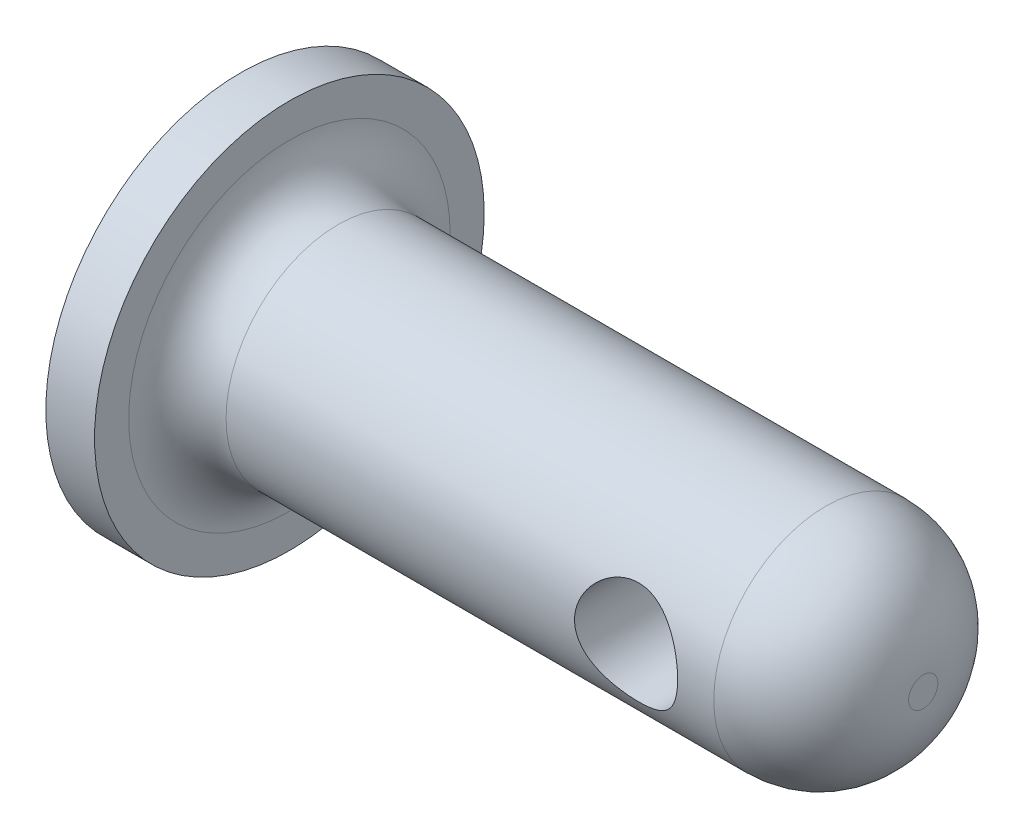
ISO-10303-21;
HEADER;
FILE_DESCRIPTION(('STEP AP214'),'2;1');
FILE_NAME('part.step','',(''),(''),'','','');
FILE_SCHEMA(('AUTOMOTIVE_DESIGN { 1 0 10303 214 1 1 1 1 }'));
ENDSEC;
DATA;
#1=APPLICATION_CONTEXT('core data for automotive mechanical design processes');
#2=APPLICATION_PROTOCOL_DEFINITION('international standard','automotive_design',2000,#1);
#3=PRODUCT_CONTEXT('',#1,'mechanical');
#4=PRODUCT('Part','Part','',(#3));
#5=PRODUCT_RELATED_PRODUCT_CATEGORY('part','',(#4));
#6=PRODUCT_DEFINITION_FORMATION('','',#4);
#7=PRODUCT_DEFINITION_CONTEXT('part definition',#1,'design');
#8=PRODUCT_DEFINITION('design','',#6,#7);
#9=PRODUCT_DEFINITION_SHAPE('','',#8);
#10=(LENGTH_UNIT() NAMED_UNIT(*) SI_UNIT(.MILLI.,.METRE.));
#11=(NAMED_UNIT(*) PLANE_ANGLE_UNIT() SI_UNIT($,.RADIAN.));
#12=(NAMED_UNIT(*) SI_UNIT($,.STERADIAN.) SOLID_ANGLE_UNIT());
#13=UNCERTAINTY_MEASURE_WITH_UNIT(LENGTH_MEASURE(1.E-05),#10,'distance_accuracy_value','');
#14=(GEOMETRIC_REPRESENTATION_CONTEXT(3) GLOBAL_UNCERTAINTY_ASSIGNED_CONTEXT((#13)) GLOBAL_UNIT_ASSIGNED_CONTEXT((#10,
#11,#12)) REPRESENTATION_CONTEXT('',''));
#15=CARTESIAN_POINT('',(0.,0.,0.));
#16=DIRECTION('',(0.,0.,1.));
#17=DIRECTION('',(1.,0.,0.));
#18=AXIS2_PLACEMENT_3D('',#15,#16,#17);
#19=CARTESIAN_POINT('',(5.,0.,0.));
#20=DIRECTION('',(-1.,0.,0.));
#21=DIRECTION('',(0.,0.,1.));
#22=AXIS2_PLACEMENT_3D('',#19,#20,#21);
#23=CYLINDRICAL_SURFACE('',#22,20.);
#24=CARTESIAN_POINT('',(5.,0.,0.));
#25=DIRECTION('',(1.,0.,0.));
#26=DIRECTION('',(0.,0.,-1.));
#27=AXIS2_PLACEMENT_3D('',#24,#25,#26);
#28=CIRCLE('',#27,20.);
#29=CARTESIAN_POINT('',(5.,0.,-20.));
#30=VERTEX_POINT('',#29);
#31=EDGE_CURVE('E109',#30,#30,#28,.T.);
#32=ORIENTED_EDGE('',*,*,#31,.F.);
#33=EDGE_LOOP('',(#32));
#34=FACE_BOUND('',#33,.T.);
#35=CARTESIAN_POINT('',(0.,0.,0.));
#36=DIRECTION('',(1.,0.,0.));
#37=DIRECTION('',(0.,0.,-1.));
#38=AXIS2_PLACEMENT_3D('',#35,#36,#37);
#39=CIRCLE('',#38,20.);
#40=CARTESIAN_POINT('',(0.,0.,-20.));
#41=VERTEX_POINT('',#40);
#42=EDGE_CURVE('E107',#41,#41,#39,.T.);
#43=ORIENTED_EDGE('',*,*,#42,.T.);
#44=EDGE_LOOP('',(#43));
#45=FACE_BOUND('',#44,.T.);
#46=ADVANCED_FACE('F41',(#34,#45),#23,.T.);
#47=CARTESIAN_POINT('',(5.,0.,0.));
#48=DIRECTION('',(1.,0.,0.));
#49=DIRECTION('',(0.,0.,-1.));
#50=AXIS2_PLACEMENT_3D('',#47,#48,#49);
#51=PLANE('',#50);
#52=CARTESIAN_POINT('',(5.,0.,0.));
#53=DIRECTION('',(1.,0.,0.));
#54=DIRECTION('',(0.,0.,-1.));
#55=AXIS2_PLACEMENT_3D('',#52,#53,#54);
#56=CIRCLE('',#55,16.5);
#57=CARTESIAN_POINT('',(5.,0.,-16.5));
#58=VERTEX_POINT('',#57);
#59=EDGE_CURVE('E10',#58,#58,#56,.F.);
#60=ORIENTED_EDGE('',*,*,#59,.T.);
#61=EDGE_LOOP('',(#60));
#62=FACE_BOUND('',#61,.T.);
#63=ORIENTED_EDGE('',*,*,#31,.T.);
#64=EDGE_LOOP('',(#63));
#65=FACE_BOUND('',#64,.T.);
#66=ADVANCED_FACE('F92',(#62,#65),#51,.T.);
#67=CARTESIAN_POINT('',(0.,0.,0.));
#68=DIRECTION('',(1.,0.,0.));
#69=DIRECTION('',(0.,0.,-1.));
#70=AXIS2_PLACEMENT_3D('',#67,#68,#69);
#71=PLANE('',#70);
#72=ORIENTED_EDGE('',*,*,#42,.F.);
#73=EDGE_LOOP('',(#72));
#74=FACE_BOUND('',#73,.T.);
#75=ADVANCED_FACE('F88',(#74),#71,.F.);
#76=CARTESIAN_POINT('',(70.0621980882499,0.,0.));
#77=DIRECTION('',(-1.,0.,0.));
#78=DIRECTION('',(0.,0.,1.));
#79=AXIS2_PLACEMENT_3D('',#76,#77,#78);
#80=CYLINDRICAL_SURFACE('',#79,11.5);
#81=CARTESIAN_POINT('',(56.3551148710914,0.,11.5));
#82=CARTESIAN_POINT('',(56.3551138637718,-0.140487088247556,11.4999991408906));
#83=CARTESIAN_POINT('',(56.3495144400302,-0.281002971891712,11.4974190525056));
#84=CARTESIAN_POINT('',(56.3271741490649,-0.561016703007874,11.4871627988924));
#85=CARTESIAN_POINT('',(56.3104273285909,-0.700513966221892,11.4794839106632));
#86=CARTESIAN_POINT('',(56.2659393151098,-0.977635517913756,11.4592129661582));
#87=CARTESIAN_POINT('',(56.2381788321788,-1.11525607964285,11.4466122901998));
#88=CARTESIAN_POINT('',(56.1719541522931,-1.38744058689531,11.4168194164316));
#89=CARTESIAN_POINT('',(56.133485579242,-1.52200325837463,11.3996253415443));
#90=CARTESIAN_POINT('',(56.0464125010414,-1.78658467687614,11.3611577345866));
#91=CARTESIAN_POINT('',(55.9978503286187,-1.91661983435074,11.3399012693142));
#92=CARTESIAN_POINT('',(55.8909403928133,-2.17195833799163,11.2937800166756));
#93=CARTESIAN_POINT('',(55.8325889590951,-2.2972598876936,11.2689138763893));
#94=CARTESIAN_POINT('',(55.6436168518646,-2.66483047218203,11.1897845958763));
#95=CARTESIAN_POINT('',(55.4989715828873,-2.8990869067523,11.1309417125886));
#96=CARTESIAN_POINT('',(55.1677796702371,-3.35297472213485,11.0030117141768));
#97=CARTESIAN_POINT('',(54.9794030876111,-3.57114981484178,10.9335446233223));
#98=CARTESIAN_POINT('',(54.5697651065936,-3.974221789329,10.7935667206789));
#99=CARTESIAN_POINT('',(54.3484828320534,-4.15909737926353,10.7230552720823));
#100=CARTESIAN_POINT('',(53.9880721163744,-4.41335951692581,10.6198577732517));
#101=CARTESIAN_POINT('',(53.8589472410283,-4.49630945400083,10.5849098518252));
#102=CARTESIAN_POINT('',(53.5934400370885,-4.65095150905467,10.5178770941121));
#103=CARTESIAN_POINT('',(53.4570607872857,-4.72264835265823,10.4857910584621));
#104=CARTESIAN_POINT('',(53.1778512329123,-4.85415273663667,10.4255666424626));
#105=CARTESIAN_POINT('',(53.0350210386574,-4.91396048022927,10.3974281946402));
#106=CARTESIAN_POINT('',(52.7439377242459,-5.02103044070435,10.3461480497092));
#107=CARTESIAN_POINT('',(52.5956876515274,-5.06829958788828,10.3230035936593));
#108=CARTESIAN_POINT('',(52.3030377694351,-5.14752349980341,10.2837177503106));
#109=CARTESIAN_POINT('',(52.1588678305945,-5.18017197672263,10.2672636700609));
#110=CARTESIAN_POINT('',(51.8678256330101,-5.2333354689726,10.2402681825733));
#111=CARTESIAN_POINT('',(51.7209547467567,-5.25385648031166,10.2297238535954));
#112=CARTESIAN_POINT('',(51.4257509547678,-5.28249751520734,10.2149635854394));
#113=CARTESIAN_POINT('',(51.2774186738442,-5.29062262515709,10.2107450506191));
#114=CARTESIAN_POINT('',(50.9805589515152,-5.29436808232196,10.2088037135539));
#115=CARTESIAN_POINT('',(50.8320315249115,-5.28998932875288,10.2110804442017));
#116=CARTESIAN_POINT('',(50.5505919822164,-5.26983333219703,10.2214952237725));
#117=CARTESIAN_POINT('',(50.4175729955101,-5.25521243855491,10.2290384161614));
#118=CARTESIAN_POINT('',(50.153347783067,-5.21601415964481,10.2490819452147));
#119=CARTESIAN_POINT('',(50.0221421526713,-5.19143358122043,10.2615838716626));
#120=CARTESIAN_POINT('',(49.7624722115107,-5.13258178845976,10.2911460357545));
#121=CARTESIAN_POINT('',(49.6340074018251,-5.09831235428692,10.3082054360081));
#122=CARTESIAN_POINT('',(49.3805436625837,-5.02041956619701,10.3463646229044));
#123=CARTESIAN_POINT('',(49.2555461032561,-4.97679257209139,10.3674659815685));
#124=CARTESIAN_POINT('',(48.8812804087077,-4.83024842238967,10.4369828597618));
#125=CARTESIAN_POINT('',(48.638483657866,-4.71297611442072,10.4909188423973));
#126=CARTESIAN_POINT('',(48.1750724580415,-4.44425328467967,10.6075443639472));
#127=CARTESIAN_POINT('',(47.9544676729809,-4.29278796523967,10.670237688274));
#128=CARTESIAN_POINT('',(47.5171027551006,-3.94132188509242,10.8053248608454));
#129=CARTESIAN_POINT('',(47.3031923293035,-3.73789020731968,10.8780451099969));
#130=CARTESIAN_POINT('',(46.9113831221154,-3.29735025130782,11.0195664400016));
#131=CARTESIAN_POINT('',(46.733496828097,-3.06023034370965,11.0883661559263));
#132=CARTESIAN_POINT('',(46.4948431960214,-2.67914230420415,11.1843756512378));
#133=CARTESIAN_POINT('',(46.4189784884652,-2.54543015773749,11.2156358050024));
#134=CARTESIAN_POINT('',(46.2788932914837,-2.27126062619757,11.2743506318171));
#135=CARTESIAN_POINT('',(46.2146679729599,-2.13080606923695,11.3018068819606));
#136=CARTESIAN_POINT('',(46.0985317409406,-1.84415257943981,11.3521045634849));
#137=CARTESIAN_POINT('',(46.0466168956959,-1.69795549810056,11.3749474679407));
#138=CARTESIAN_POINT('',(45.9556744564943,-1.40089367664722,11.4153384845152));
#139=CARTESIAN_POINT('',(45.9166456344886,-1.250029382822,11.4328871011703));
#140=CARTESIAN_POINT('',(45.8543576105409,-0.956157051556575,11.4610611816406));
#141=CARTESIAN_POINT('',(45.8301480416587,-0.81338965484342,11.4721016230924));
#142=CARTESIAN_POINT('',(45.7934965357483,-0.526046097667848,11.4888633362873));
#143=CARTESIAN_POINT('',(45.7810537646202,-0.381470066148365,11.4945849850572));
#144=CARTESIAN_POINT('',(45.7680898542299,-0.0917166030402881,11.5005469862739));
#145=CARTESIAN_POINT('',(45.7675650495852,0.053460629909135,11.5007890239805));
#146=CARTESIAN_POINT('',(45.7784344239932,0.34327035712373,11.4957890806871));
#147=CARTESIAN_POINT('',(45.7898282193536,0.48790286877455,11.490547276227));
#148=CARTESIAN_POINT('',(45.8232921655064,0.766305168067351,11.4752325958197));
#149=CARTESIAN_POINT('',(45.844637541703,0.900180996596812,11.4654880297127));
#150=CARTESIAN_POINT('',(45.8974380113821,1.16556118385768,11.4415569400658));
#151=CARTESIAN_POINT('',(45.9288963522948,1.29706476647902,11.4273689897238));
#152=CARTESIAN_POINT('',(46.0016065647184,1.55677694274085,11.3948917990542));
#153=CARTESIAN_POINT('',(46.0428555494742,1.68498649529512,11.3766037677165));
#154=CARTESIAN_POINT('',(46.1347747908936,1.93740521488176,11.3363502085349));
#155=CARTESIAN_POINT('',(46.185448647117,2.061612832154,11.3143832759601));
#156=CARTESIAN_POINT('',(46.3543770926879,2.43459361865599,11.2422393851631));
#157=CARTESIAN_POINT('',(46.4873424703206,2.6758896242733,11.1868361520306));
#158=CARTESIAN_POINT('',(46.7876986432819,3.13348102972415,11.0674041808618));
#159=CARTESIAN_POINT('',(46.9551045623954,3.34976538085419,11.0033716577436));
#160=CARTESIAN_POINT('',(47.3362770614196,3.7709297878035,10.8666083235735));
#161=CARTESIAN_POINT('',(47.5527880605486,3.97324174125661,10.7936024615522));
#162=CARTESIAN_POINT('',(48.017570347199,4.33966756472716,10.6515727290632));
#163=CARTESIAN_POINT('',(48.2658555397808,4.5037646219095,10.5825506212747));
#164=CARTESIAN_POINT('',(48.6617358212055,4.71978067838761,10.4871409964642));
#165=CARTESIAN_POINT('',(48.7998315383812,4.78752936120542,10.4562994948288));
#166=CARTESIAN_POINT('',(49.0821269065119,4.91100632221587,10.3988774548232));
#167=CARTESIAN_POINT('',(49.226323796931,4.96673996860547,10.3722950149162));
#168=CARTESIAN_POINT('',(49.5197365677926,5.06554389025003,10.3244023198901));
#169=CARTESIAN_POINT('',(49.6689491035679,5.10862242489574,10.3030886275561));
#170=CARTESIAN_POINT('',(49.9712942330912,5.18160871689832,10.2665769762682));
#171=CARTESIAN_POINT('',(50.1244263360151,5.21151811489236,10.2513782555193));
#172=CARTESIAN_POINT('',(50.4195369957779,5.25568280575572,10.2288002311184));
#173=CARTESIAN_POINT('',(50.5612999555705,5.27109137785597,10.220846885388));
#174=CARTESIAN_POINT('',(50.845811452691,5.29041300562372,10.2108594842913));
#175=CARTESIAN_POINT('',(50.9885599162458,5.29432691260681,10.2088249905644));
#176=CARTESIAN_POINT('',(51.2738324815863,5.29060716010956,10.2107531313405));
#177=CARTESIAN_POINT('',(51.4163566256208,5.28297602649103,10.2147144540592));
#178=CARTESIAN_POINT('',(51.7000381596923,5.2562749450157,10.228479742678));
#179=CARTESIAN_POINT('',(51.8411955787407,5.23720524050798,10.2382835842818));
#180=CARTESIAN_POINT('',(52.1113278526289,5.18958335547306,10.2624989319261));
#181=CARTESIAN_POINT('',(52.240468503112,5.16178079315998,10.2765436008389));
#182=CARTESIAN_POINT('',(52.4958214480086,5.09677091767207,10.3089395558161));
#183=CARTESIAN_POINT('',(52.6220328010525,5.05956062566227,10.3272922058147));
#184=CARTESIAN_POINT('',(52.9951225890544,4.93431714208074,10.3880313354019));
#185=CARTESIAN_POINT('',(53.2366364486459,4.83263918634091,10.4361162650592));
#186=CARTESIAN_POINT('',(53.7154278918297,4.58828421970619,10.5459298920667));
#187=CARTESIAN_POINT('',(53.95138380189,4.44335180365339,10.6083476015177));
#188=CARTESIAN_POINT('',(54.3970683570103,4.11941640970129,10.7382914912101));
#189=CARTESIAN_POINT('',(54.6067850338082,3.94039797766008,10.8058199802105));
#190=CARTESIAN_POINT('',(55.0150553446902,3.53281282934863,10.9462253322404));
#191=CARTESIAN_POINT('',(55.2105771305677,3.30113128022879,11.0189892210738));
#192=CARTESIAN_POINT('',(55.4727703972068,2.92999572051048,11.1212287039563));
#193=CARTESIAN_POINT('',(55.5550413679083,2.80223361850906,11.1541817025179));
#194=CARTESIAN_POINT('',(55.7085746431667,2.53953885216545,11.2169038078408));
#195=CARTESIAN_POINT('',(55.7798420367273,2.40460954160091,11.2466743844569));
#196=CARTESIAN_POINT('',(55.9102812392418,2.12934439124599,11.3020121072628));
#197=CARTESIAN_POINT('',(55.9695307199926,1.98905072250039,11.327606022175));
#198=CARTESIAN_POINT('',(56.0758943403526,1.7032464187442,11.3740886686556));
#199=CARTESIAN_POINT('',(56.1230143644377,1.55773835262388,11.3949796811671));
#200=CARTESIAN_POINT('',(56.204508123945,1.26291509244695,11.4314066787035));
#201=CARTESIAN_POINT('',(56.2389116557157,1.11360968557779,11.4469551758151));
#202=CARTESIAN_POINT('',(56.2946739731362,0.812175155336934,11.4722802560494));
#203=CARTESIAN_POINT('',(56.3160415214615,0.660047999751952,11.4820607162491));
#204=CARTESIAN_POINT('',(56.3388673484538,0.422963661309401,11.4925291335596));
#205=CARTESIAN_POINT('',(56.3449571716759,0.338516300340026,11.4953278746827));
#206=CARTESIAN_POINT('',(56.3530812722771,0.169382784374583,11.4990635832318));
#207=CARTESIAN_POINT('',(56.3551154783825,0.0846966252080554,11.5000005179384));
#208=CARTESIAN_POINT('',(56.3551148710914,0.,11.5));
#209=B_SPLINE_CURVE_WITH_KNOTS('',3,(#81,#82,#83,#84,#85,#86,#87,#88,#89,#90,#91,#92,#93,#94,
#95,#96,#97,#98,#99,#100,#101,#102,#103,#104,#105,#106,#107,#108,#109,#110,#111,#112,#113,#114,
#115,#116,#117,#118,#119,#120,#121,#122,#123,#124,#125,#126,#127,#128,#129,#130,#131,#132,#133,
#134,#135,#136,#137,#138,#139,#140,#141,#142,#143,#144,#145,#146,#147,#148,#149,#150,#151,#152,
#153,#154,#155,#156,#157,#158,#159,#160,#161,#162,#163,#164,#165,#166,#167,#168,#169,#170,#171,
#172,#173,#174,#175,#176,#177,#178,#179,#180,#181,#182,#183,#184,#185,#186,#187,#188,#189,#190,
#191,#192,#193,#194,#195,#196,#197,#198,#199,#200,#201,#202,#203,#204,#205,#206,#207,#208),
.UNSPECIFIED.,.T.,.F.,(4,2,2,2,2,2,2,2,2,2,2,2,2,2,2,2,2,2,2,2,2,2,2,2,2,2,2,2,2,2,2,2,2,2,2,2,
2,2,2,2,2,2,2,2,2,2,2,2,2,2,2,2,2,2,2,2,2,2,2,2,2,2,2,4),(0.,0.421376731107799,
0.842978678568302,1.26532232558451,1.68783882665324,2.10861780540248,2.52955490290162,
3.37041422709118,4.25633040271315,5.14281104149725,5.61452211209329,6.08603455922959,
6.5575389462163,7.02878217888004,7.47436678536178,7.91973090314978,8.36491222609597,
8.8100615346171,9.21168631959054,9.61343997077054,10.0151198544253,10.4169562800688,
11.2382232915143,12.0598464053634,12.9679664952355,13.8764008382375,14.3465241768739,
14.8164520159436,15.2862295655427,15.7559623320141,16.1910693028587,16.6261454284439,
17.0610877441188,17.4960160582363,17.9032947346171,18.3107043253757,18.7179939409906,
19.1254394298303,19.9646507462047,20.8042313728767,21.7158031244881,22.6277751721765,
23.0978889484337,23.5677922452789,24.0373881737062,24.5069255823764,24.9348114846591,
25.3626656961424,25.7904263138154,26.2181778314476,26.6162544036139,27.0144571797425,
27.8103189291683,28.658487776583,29.5070420920046,30.437509509622,30.9035096333724,
31.3692935886824,31.831963874463,32.294409275876,32.7557641352101,33.2168085331152,
33.4708429808648,33.7248818929899),.UNSPECIFIED.);
#210=CARTESIAN_POINT('',(56.3551148710914,0.,11.5));
#211=VERTEX_POINT('',#210);
#212=EDGE_CURVE('E45',#211,#211,#209,.T.);
#213=ORIENTED_EDGE('',*,*,#212,.T.);
#214=EDGE_LOOP('',(#213));
#215=FACE_BOUND('',#214,.T.);
#216=CARTESIAN_POINT('',(56.3551148710914,0.,-11.5));
#217=CARTESIAN_POINT('',(56.3551138637718,0.140487088247556,-11.4999991408906));
#218=CARTESIAN_POINT('',(56.3495144400302,0.281002971891712,-11.4974190525056));
#219=CARTESIAN_POINT('',(56.3271741490649,0.561016703007874,-11.4871627988924));
#220=CARTESIAN_POINT('',(56.3104273285909,0.700513966221892,-11.4794839106632));
#221=CARTESIAN_POINT('',(56.2659393151098,0.977635517913756,-11.4592129661582));
#222=CARTESIAN_POINT('',(56.2381788321788,1.11525607964285,-11.4466122901998));
#223=CARTESIAN_POINT('',(56.1719541522931,1.38744058689531,-11.4168194164316));
#224=CARTESIAN_POINT('',(56.133485579242,1.52200325837463,-11.3996253415443));
#225=CARTESIAN_POINT('',(56.0464125010414,1.78658467687614,-11.3611577345866));
#226=CARTESIAN_POINT('',(55.9978503286187,1.91661983435074,-11.3399012693142));
#227=CARTESIAN_POINT('',(55.8909403928133,2.17195833799163,-11.2937800166756));
#228=CARTESIAN_POINT('',(55.8325889590951,2.2972598876936,-11.2689138763893));
#229=CARTESIAN_POINT('',(55.6436168518646,2.66483047218203,-11.1897845958763));
#230=CARTESIAN_POINT('',(55.4989715828873,2.8990869067523,-11.1309417125886));
#231=CARTESIAN_POINT('',(55.1677796702371,3.35297472213485,-11.0030117141768));
#232=CARTESIAN_POINT('',(54.9794030876111,3.57114981484178,-10.9335446233223));
#233=CARTESIAN_POINT('',(54.5697651065936,3.974221789329,-10.7935667206789));
#234=CARTESIAN_POINT('',(54.3484828320534,4.15909737926353,-10.7230552720823));
#235=CARTESIAN_POINT('',(53.9880721163744,4.41335951692581,-10.6198577732517));
#236=CARTESIAN_POINT('',(53.8589472410283,4.49630945400083,-10.5849098518252));
#237=CARTESIAN_POINT('',(53.5934400370885,4.65095150905467,-10.5178770941121));
#238=CARTESIAN_POINT('',(53.4570607872857,4.72264835265823,-10.4857910584621));
#239=CARTESIAN_POINT('',(53.1778512329123,4.85415273663667,-10.4255666424626));
#240=CARTESIAN_POINT('',(53.0350210386574,4.91396048022927,-10.3974281946402));
#241=CARTESIAN_POINT('',(52.7439377242459,5.02103044070435,-10.3461480497092));
#242=CARTESIAN_POINT('',(52.5956876515274,5.06829958788828,-10.3230035936593));
#243=CARTESIAN_POINT('',(52.3030377694351,5.14752349980341,-10.2837177503106));
#244=CARTESIAN_POINT('',(52.1588678305945,5.18017197672263,-10.2672636700609));
#245=CARTESIAN_POINT('',(51.8678256330101,5.2333354689726,-10.2402681825733));
#246=CARTESIAN_POINT('',(51.7209547467567,5.25385648031166,-10.2297238535954));
#247=CARTESIAN_POINT('',(51.4257509547678,5.28249751520734,-10.2149635854394));
#248=CARTESIAN_POINT('',(51.2774186738442,5.29062262515709,-10.2107450506191));
#249=CARTESIAN_POINT('',(50.9805589515152,5.29436808232196,-10.2088037135539));
#250=CARTESIAN_POINT('',(50.8320315249115,5.28998932875288,-10.2110804442017));
#251=CARTESIAN_POINT('',(50.5505919822164,5.26983333219703,-10.2214952237725));
#252=CARTESIAN_POINT('',(50.4175729955101,5.25521243855491,-10.2290384161614));
#253=CARTESIAN_POINT('',(50.153347783067,5.21601415964481,-10.2490819452147));
#254=CARTESIAN_POINT('',(50.0221421526713,5.19143358122043,-10.2615838716626));
#255=CARTESIAN_POINT('',(49.7624722115107,5.13258178845976,-10.2911460357545));
#256=CARTESIAN_POINT('',(49.6340074018251,5.09831235428692,-10.3082054360081));
#257=CARTESIAN_POINT('',(49.3805436625837,5.02041956619701,-10.3463646229044));
#258=CARTESIAN_POINT('',(49.2555461032561,4.97679257209139,-10.3674659815685));
#259=CARTESIAN_POINT('',(48.8812804087077,4.83024842238967,-10.4369828597618));
#260=CARTESIAN_POINT('',(48.638483657866,4.71297611442072,-10.4909188423973));
#261=CARTESIAN_POINT('',(48.1750724580415,4.44425328467967,-10.6075443639472));
#262=CARTESIAN_POINT('',(47.9544676729809,4.29278796523967,-10.670237688274));
#263=CARTESIAN_POINT('',(47.5171027551006,3.94132188509242,-10.8053248608454));
#264=CARTESIAN_POINT('',(47.3031923293035,3.73789020731968,-10.8780451099969));
#265=CARTESIAN_POINT('',(46.9113831221154,3.29735025130782,-11.0195664400016));
#266=CARTESIAN_POINT('',(46.733496828097,3.06023034370965,-11.0883661559263));
#267=CARTESIAN_POINT('',(46.4948431960214,2.67914230420415,-11.1843756512378));
#268=CARTESIAN_POINT('',(46.4189784884652,2.54543015773749,-11.2156358050024));
#269=CARTESIAN_POINT('',(46.2788932914837,2.27126062619757,-11.2743506318171));
#270=CARTESIAN_POINT('',(46.2146679729599,2.13080606923695,-11.3018068819606));
#271=CARTESIAN_POINT('',(46.0985317409406,1.84415257943981,-11.3521045634849));
#272=CARTESIAN_POINT('',(46.0466168956959,1.69795549810056,-11.3749474679407));
#273=CARTESIAN_POINT('',(45.9556744564943,1.40089367664722,-11.4153384845152));
#274=CARTESIAN_POINT('',(45.9166456344886,1.250029382822,-11.4328871011703));
#275=CARTESIAN_POINT('',(45.8543576105409,0.956157051556575,-11.4610611816406));
#276=CARTESIAN_POINT('',(45.8301480416587,0.81338965484342,-11.4721016230924));
#277=CARTESIAN_POINT('',(45.7934965357483,0.526046097667848,-11.4888633362873));
#278=CARTESIAN_POINT('',(45.7810537646202,0.381470066148365,-11.4945849850572));
#279=CARTESIAN_POINT('',(45.7680898542299,0.0917166030402881,-11.5005469862739));
#280=CARTESIAN_POINT('',(45.7675650495852,-0.053460629909135,-11.5007890239805));
#281=CARTESIAN_POINT('',(45.7784344239932,-0.34327035712373,-11.4957890806871));
#282=CARTESIAN_POINT('',(45.7898282193536,-0.48790286877455,-11.490547276227));
#283=CARTESIAN_POINT('',(45.8232921655064,-0.766305168067351,-11.4752325958197));
#284=CARTESIAN_POINT('',(45.844637541703,-0.900180996596812,-11.4654880297127));
#285=CARTESIAN_POINT('',(45.8974380113821,-1.16556118385768,-11.4415569400658));
#286=CARTESIAN_POINT('',(45.9288963522948,-1.29706476647902,-11.4273689897238));
#287=CARTESIAN_POINT('',(46.0016065647184,-1.55677694274085,-11.3948917990542));
#288=CARTESIAN_POINT('',(46.0428555494742,-1.68498649529512,-11.3766037677165));
#289=CARTESIAN_POINT('',(46.1347747908936,-1.93740521488176,-11.3363502085349));
#290=CARTESIAN_POINT('',(46.185448647117,-2.061612832154,-11.3143832759601));
#291=CARTESIAN_POINT('',(46.3543770926879,-2.43459361865599,-11.2422393851631));
#292=CARTESIAN_POINT('',(46.4873424703206,-2.6758896242733,-11.1868361520306));
#293=CARTESIAN_POINT('',(46.7876986432819,-3.13348102972415,-11.0674041808618));
#294=CARTESIAN_POINT('',(46.9551045623954,-3.34976538085419,-11.0033716577436));
#295=CARTESIAN_POINT('',(47.3362770614196,-3.7709297878035,-10.8666083235735));
#296=CARTESIAN_POINT('',(47.5527880605486,-3.97324174125661,-10.7936024615522));
#297=CARTESIAN_POINT('',(48.017570347199,-4.33966756472716,-10.6515727290632));
#298=CARTESIAN_POINT('',(48.2658555397808,-4.5037646219095,-10.5825506212747));
#299=CARTESIAN_POINT('',(48.6617358212055,-4.71978067838761,-10.4871409964642));
#300=CARTESIAN_POINT('',(48.7998315383812,-4.78752936120542,-10.4562994948288));
#301=CARTESIAN_POINT('',(49.0821269065119,-4.91100632221587,-10.3988774548232));
#302=CARTESIAN_POINT('',(49.226323796931,-4.96673996860547,-10.3722950149162));
#303=CARTESIAN_POINT('',(49.5197365677926,-5.06554389025003,-10.3244023198901));
#304=CARTESIAN_POINT('',(49.6689491035679,-5.10862242489574,-10.3030886275561));
#305=CARTESIAN_POINT('',(49.9712942330912,-5.18160871689832,-10.2665769762682));
#306=CARTESIAN_POINT('',(50.1244263360151,-5.21151811489236,-10.2513782555193));
#307=CARTESIAN_POINT('',(50.4195369957779,-5.25568280575572,-10.2288002311184));
#308=CARTESIAN_POINT('',(50.5612999555705,-5.27109137785597,-10.220846885388));
#309=CARTESIAN_POINT('',(50.845811452691,-5.29041300562372,-10.2108594842913));
#310=CARTESIAN_POINT('',(50.9885599162458,-5.29432691260681,-10.2088249905644));
#311=CARTESIAN_POINT('',(51.2738324815863,-5.29060716010956,-10.2107531313405));
#312=CARTESIAN_POINT('',(51.4163566256208,-5.28297602649103,-10.2147144540592));
#313=CARTESIAN_POINT('',(51.7000381596923,-5.2562749450157,-10.228479742678));
#314=CARTESIAN_POINT('',(51.8411955787407,-5.23720524050798,-10.2382835842818));
#315=CARTESIAN_POINT('',(52.1113278526289,-5.18958335547306,-10.2624989319261));
#316=CARTESIAN_POINT('',(52.240468503112,-5.16178079315998,-10.2765436008389));
#317=CARTESIAN_POINT('',(52.4958214480086,-5.09677091767207,-10.3089395558161));
#318=CARTESIAN_POINT('',(52.6220328010525,-5.05956062566227,-10.3272922058147));
#319=CARTESIAN_POINT('',(52.9951225890544,-4.93431714208074,-10.3880313354019));
#320=CARTESIAN_POINT('',(53.2366364486459,-4.83263918634091,-10.4361162650592));
#321=CARTESIAN_POINT('',(53.7154278918297,-4.58828421970619,-10.5459298920667));
#322=CARTESIAN_POINT('',(53.95138380189,-4.44335180365339,-10.6083476015177));
#323=CARTESIAN_POINT('',(54.3970683570103,-4.11941640970129,-10.7382914912101));
#324=CARTESIAN_POINT('',(54.6067850338082,-3.94039797766008,-10.8058199802105));
#325=CARTESIAN_POINT('',(55.0150553446902,-3.53281282934863,-10.9462253322404));
#326=CARTESIAN_POINT('',(55.2105771305677,-3.30113128022879,-11.0189892210738));
#327=CARTESIAN_POINT('',(55.4727703972068,-2.92999572051048,-11.1212287039563));
#328=CARTESIAN_POINT('',(55.5550413679083,-2.80223361850906,-11.1541817025179));
#329=CARTESIAN_POINT('',(55.7085746431667,-2.53953885216545,-11.2169038078408));
#330=CARTESIAN_POINT('',(55.7798420367273,-2.40460954160091,-11.2466743844569));
#331=CARTESIAN_POINT('',(55.9102812392418,-2.12934439124599,-11.3020121072628));
#332=CARTESIAN_POINT('',(55.9695307199926,-1.98905072250039,-11.327606022175));
#333=CARTESIAN_POINT('',(56.0758943403526,-1.7032464187442,-11.3740886686556));
#334=CARTESIAN_POINT('',(56.1230143644377,-1.55773835262388,-11.3949796811671));
#335=CARTESIAN_POINT('',(56.204508123945,-1.26291509244695,-11.4314066787035));
#336=CARTESIAN_POINT('',(56.2389116557157,-1.11360968557779,-11.4469551758151));
#337=CARTESIAN_POINT('',(56.2946739731362,-0.812175155336934,-11.4722802560494));
#338=CARTESIAN_POINT('',(56.3160415214615,-0.660047999751952,-11.4820607162491));
#339=CARTESIAN_POINT('',(56.3388673484538,-0.422963661309401,-11.4925291335596));
#340=CARTESIAN_POINT('',(56.3449571716759,-0.338516300340026,-11.4953278746827));
#341=CARTESIAN_POINT('',(56.3530812722771,-0.169382784374583,-11.4990635832318));
#342=CARTESIAN_POINT('',(56.3551154783825,-0.0846966252080554,-11.5000005179384));
#343=CARTESIAN_POINT('',(56.3551148710914,0.,-11.5));
#344=B_SPLINE_CURVE_WITH_KNOTS('',3,(#216,#217,#218,#219,#220,#221,#222,#223,#224,#225,#226,
#227,#228,#229,#230,#231,#232,#233,#234,#235,#236,#237,#238,#239,#240,#241,#242,#243,#244,#245,
#246,#247,#248,#249,#250,#251,#252,#253,#254,#255,#256,#257,#258,#259,#260,#261,#262,#263,#264,
#265,#266,#267,#268,#269,#270,#271,#272,#273,#274,#275,#276,#277,#278,#279,#280,#281,#282,#283,
#284,#285,#286,#287,#288,#289,#290,#291,#292,#293,#294,#295,#296,#297,#298,#299,#300,#301,#302,
#303,#304,#305,#306,#307,#308,#309,#310,#311,#312,#313,#314,#315,#316,#317,#318,#319,#320,#321,
#322,#323,#324,#325,#326,#327,#328,#329,#330,#331,#332,#333,#334,#335,#336,#337,#338,#339,#340,
#341,#342,#343),.UNSPECIFIED.,.T.,.F.,(4,2,2,2,2,2,2,2,2,2,2,2,2,2,2,2,2,2,2,2,2,2,2,2,2,2,2,2,
2,2,2,2,2,2,2,2,2,2,2,2,2,2,2,2,2,2,2,2,2,2,2,2,2,2,2,2,2,2,2,2,2,2,2,4),(0.,0.421376731107799,
0.842978678568302,1.26532232558451,1.68783882665324,2.10861780540248,2.52955490290162,
3.37041422709118,4.25633040271315,5.14281104149725,5.61452211209329,6.08603455922959,
6.5575389462163,7.02878217888004,7.47436678536178,7.91973090314978,8.36491222609597,
8.8100615346171,9.21168631959054,9.61343997077054,10.0151198544253,10.4169562800688,
11.2382232915143,12.0598464053634,12.9679664952355,13.8764008382375,14.3465241768739,
14.8164520159436,15.2862295655427,15.7559623320141,16.1910693028587,16.6261454284439,
17.0610877441188,17.4960160582363,17.9032947346171,18.3107043253757,18.7179939409906,
19.1254394298303,19.9646507462047,20.8042313728767,21.7158031244881,22.6277751721765,
23.0978889484337,23.5677922452789,24.0373881737062,24.5069255823764,24.9348114846591,
25.3626656961424,25.7904263138154,26.2181778314476,26.6162544036139,27.0144571797425,
27.8103189291683,28.658487776583,29.5070420920046,30.437509509622,30.9035096333724,
31.3692935886824,31.831963874463,32.294409275876,32.7557641352101,33.2168085331152,
33.4708429808648,33.7248818929899),.UNSPECIFIED.);
#345=CARTESIAN_POINT('',(56.3551148710914,0.,-11.5));
#346=VERTEX_POINT('',#345);
#347=EDGE_CURVE('E64',#346,#346,#344,.T.);
#348=ORIENTED_EDGE('',*,*,#347,.T.);
#349=EDGE_LOOP('',(#348));
#350=FACE_BOUND('',#349,.T.);
#351=CARTESIAN_POINT('',(10.,0.,0.));
#352=DIRECTION('',(1.,0.,0.));
#353=DIRECTION('',(0.,0.,-1.));
#354=AXIS2_PLACEMENT_3D('',#351,#352,#353);
#355=CIRCLE('',#354,11.5);
#356=CARTESIAN_POINT('',(10.,0.,-11.5));
#357=VERTEX_POINT('',#356);
#358=EDGE_CURVE('E55',#357,#357,#355,.T.);
#359=ORIENTED_EDGE('',*,*,#358,.T.);
#360=EDGE_LOOP('',(#359));
#361=FACE_BOUND('',#360,.T.);
#362=CARTESIAN_POINT('',(60.0621980882499,0.,0.));
#363=DIRECTION('',(1.,0.,0.));
#364=DIRECTION('',(0.,0.,-1.));
#365=AXIS2_PLACEMENT_3D('',#362,#363,#364);
#366=CIRCLE('',#365,11.5);
#367=CARTESIAN_POINT('',(60.0621980882499,0.,-11.5));
#368=VERTEX_POINT('',#367);
#369=EDGE_CURVE('E61',#368,#368,#366,.F.);
#370=ORIENTED_EDGE('',*,*,#369,.T.);
#371=EDGE_LOOP('',(#370));
#372=FACE_BOUND('',#371,.T.);
#373=ADVANCED_FACE('F70',(#215,#350,#361,#372),#80,.T.);
#374=CARTESIAN_POINT('',(70.0621980882499,0.,0.));
#375=DIRECTION('',(1.,0.,0.));
#376=DIRECTION('',(0.,0.,-1.));
#377=AXIS2_PLACEMENT_3D('',#374,#375,#376);
#378=PLANE('',#377);
#379=CARTESIAN_POINT('',(70.0621980882499,0.,0.));
#380=DIRECTION('',(1.,0.,0.));
#381=DIRECTION('',(0.,0.,-1.));
#382=AXIS2_PLACEMENT_3D('',#379,#380,#381);
#383=CIRCLE('',#382,1.5);
#384=CARTESIAN_POINT('',(70.0621980882499,0.,-1.5));
#385=VERTEX_POINT('',#384);
#386=EDGE_CURVE('E114',#385,#385,#383,.T.);
#387=ORIENTED_EDGE('',*,*,#386,.T.);
#388=EDGE_LOOP('',(#387));
#389=FACE_BOUND('',#388,.T.);
#390=ADVANCED_FACE('F78',(#389),#378,.T.);
#391=CARTESIAN_POINT('',(60.0621980882499,0.,0.));
#392=DIRECTION('',(1.,0.,0.));
#393=DIRECTION('',(0.,0.,-1.));
#394=AXIS2_PLACEMENT_3D('',#391,#392,#393);
#395=DEGENERATE_TOROIDAL_SURFACE('',#394,1.5,10.,.T.);
#396=ORIENTED_EDGE('',*,*,#369,.F.);
#397=EDGE_LOOP('',(#396));
#398=FACE_BOUND('',#397,.T.);
#399=ORIENTED_EDGE('',*,*,#386,.F.);
#400=EDGE_LOOP('',(#399));
#401=FACE_BOUND('',#400,.T.);
#402=ADVANCED_FACE('F81',(#398,#401),#395,.T.);
#403=CARTESIAN_POINT('',(10.,0.,0.));
#404=DIRECTION('',(1.,0.,0.));
#405=DIRECTION('',(0.,0.,-1.));
#406=AXIS2_PLACEMENT_3D('',#403,#404,#405);
#407=TOROIDAL_SURFACE('',#406,16.5,5.);
#408=ORIENTED_EDGE('',*,*,#59,.F.);
#409=EDGE_LOOP('',(#408));
#410=FACE_BOUND('',#409,.T.);
#411=ORIENTED_EDGE('',*,*,#358,.F.);
#412=EDGE_LOOP('',(#411));
#413=FACE_BOUND('',#412,.T.);
#414=ADVANCED_FACE('F43',(#410,#413),#407,.F.);
#415=CARTESIAN_POINT('',(51.0621980882499,0.,-20.));
#416=DIRECTION('',(0.,0.,1.));
#417=DIRECTION('',(1.,0.,0.));
#418=AXIS2_PLACEMENT_3D('',#415,#416,#417);
#419=CYLINDRICAL_SURFACE('',#418,5.29291678284149);
#420=ORIENTED_EDGE('',*,*,#347,.F.);
#421=EDGE_LOOP('',(#420));
#422=FACE_BOUND('',#421,.T.);
#423=ORIENTED_EDGE('',*,*,#212,.F.);
#424=EDGE_LOOP('',(#423));
#425=FACE_BOUND('',#424,.T.);
#426=ADVANCED_FACE('F74',(#422,#425),#419,.F.);
#427=CLOSED_SHELL('',(#46,#66,#75,#373,#390,#402,#414,#426));
#428=MANIFOLD_SOLID_BREP('B2',#427);
#429=ADVANCED_BREP_SHAPE_REPRESENTATION('',(#18,#428),#14);
#430=SHAPE_DEFINITION_REPRESENTATION(#9,#429);
ENDSEC;
END-ISO-10303-21;
